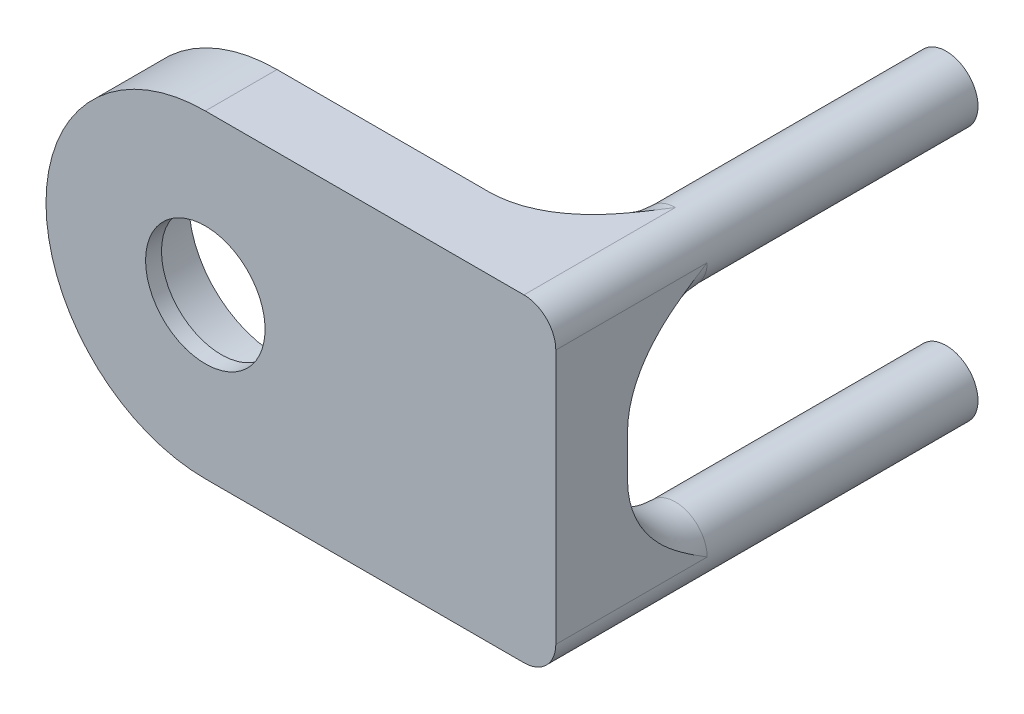
ISO-10303-21;
HEADER;
FILE_DESCRIPTION(('STEP AP214'),'2;1');
FILE_NAME('part.step','',(''),(''),'','','');
FILE_SCHEMA(('AUTOMOTIVE_DESIGN { 1 0 10303 214 1 1 1 1 }'));
ENDSEC;
DATA;
#1=APPLICATION_CONTEXT('core data for automotive mechanical design processes');
#2=APPLICATION_PROTOCOL_DEFINITION('international standard','automotive_design',2000,#1);
#3=PRODUCT_CONTEXT('',#1,'mechanical');
#4=PRODUCT('Part','Part','',(#3));
#5=PRODUCT_RELATED_PRODUCT_CATEGORY('part','',(#4));
#6=PRODUCT_DEFINITION_FORMATION('','',#4);
#7=PRODUCT_DEFINITION_CONTEXT('part definition',#1,'design');
#8=PRODUCT_DEFINITION('design','',#6,#7);
#9=PRODUCT_DEFINITION_SHAPE('','',#8);
#10=(LENGTH_UNIT() NAMED_UNIT(*) SI_UNIT(.MILLI.,.METRE.));
#11=(NAMED_UNIT(*) PLANE_ANGLE_UNIT() SI_UNIT($,.RADIAN.));
#12=(NAMED_UNIT(*) SI_UNIT($,.STERADIAN.) SOLID_ANGLE_UNIT());
#13=UNCERTAINTY_MEASURE_WITH_UNIT(LENGTH_MEASURE(1.E-05),#10,'distance_accuracy_value','');
#14=(GEOMETRIC_REPRESENTATION_CONTEXT(3) GLOBAL_UNCERTAINTY_ASSIGNED_CONTEXT((#13)) GLOBAL_UNIT_ASSIGNED_CONTEXT((#10,
#11,#12)) REPRESENTATION_CONTEXT('',''));
#15=CARTESIAN_POINT('',(0.,0.,0.));
#16=DIRECTION('',(0.,0.,1.));
#17=DIRECTION('',(1.,0.,0.));
#18=AXIS2_PLACEMENT_3D('',#15,#16,#17);
#19=CARTESIAN_POINT('',(40.,16.,9.));
#20=DIRECTION('',(0.,0.,-1.));
#21=DIRECTION('',(-1.,0.,0.));
#22=AXIS2_PLACEMENT_3D('',#19,#20,#21);
#23=CYLINDRICAL_SURFACE('',#22,4.);
#24=DIRECTION('',(0.,0.,-1.));
#25=VECTOR('',#24,1.);
#26=CARTESIAN_POINT('',(44.,16.,9.));
#27=LINE('',#26,#25);
#28=CARTESIAN_POINT('',(44.,16.,9.));
#29=VERTEX_POINT('',#28);
#30=CARTESIAN_POINT('',(44.,16.,-10.));
#31=VERTEX_POINT('',#30);
#32=EDGE_CURVE('E67',#29,#31,#27,.T.);
#33=ORIENTED_EDGE('',*,*,#32,.T.);
#34=CARTESIAN_POINT('',(40.,16.,-10.));
#35=DIRECTION('',(0.,0.,1.));
#36=DIRECTION('',(1.,0.,0.));
#37=AXIS2_PLACEMENT_3D('',#34,#35,#36);
#38=CIRCLE('',#37,4.);
#39=CARTESIAN_POINT('',(40.,20.,-10.));
#40=VERTEX_POINT('',#39);
#41=EDGE_CURVE('E128',#31,#40,#38,.F.);
#42=ORIENTED_EDGE('',*,*,#41,.T.);
#43=DIRECTION('',(0.,0.,-1.));
#44=VECTOR('',#43,1.);
#45=CARTESIAN_POINT('',(40.,20.,9.));
#46=LINE('',#45,#44);
#47=CARTESIAN_POINT('',(40.,20.,9.));
#48=VERTEX_POINT('',#47);
#49=EDGE_CURVE('E74',#48,#40,#46,.T.);
#50=ORIENTED_EDGE('',*,*,#49,.F.);
#51=CARTESIAN_POINT('',(40.,16.,9.));
#52=DIRECTION('',(0.,0.,1.));
#53=DIRECTION('',(1.,0.,0.));
#54=AXIS2_PLACEMENT_3D('',#51,#52,#53);
#55=CIRCLE('',#54,4.);
#56=EDGE_CURVE('E117',#29,#48,#55,.T.);
#57=ORIENTED_EDGE('',*,*,#56,.F.);
#58=EDGE_LOOP('',(#33,#42,#50,#57));
#59=FACE_BOUND('',#58,.T.);
#60=CARTESIAN_POINT('',(40.,16.,-44.));
#61=DIRECTION('',(0.,0.,1.));
#62=DIRECTION('',(1.,0.,0.));
#63=AXIS2_PLACEMENT_3D('',#60,#61,#62);
#64=CIRCLE('',#63,4.);
#65=CARTESIAN_POINT('',(44.,16.,-44.));
#66=VERTEX_POINT('',#65);
#67=EDGE_CURVE('E159',#66,#66,#64,.T.);
#68=ORIENTED_EDGE('',*,*,#67,.T.);
#69=EDGE_LOOP('',(#68));
#70=FACE_BOUND('',#69,.T.);
#71=ADVANCED_FACE('F45',(#59,#70),#23,.T.);
#72=CARTESIAN_POINT('',(0.,20.,9.));
#73=DIRECTION('',(0.,1.,0.));
#74=DIRECTION('',(0.,0.,1.));
#75=AXIS2_PLACEMENT_3D('',#72,#73,#74);
#76=PLANE('',#75);
#77=DIRECTION('',(1.,0.,0.));
#78=VECTOR('',#77,1.);
#79=CARTESIAN_POINT('',(0.,20.,0.));
#80=LINE('',#79,#78);
#81=CARTESIAN_POINT('',(0.,20.,0.));
#82=VERTEX_POINT('',#81);
#83=CARTESIAN_POINT('',(26.5835921350013,20.,0.));
#84=VERTEX_POINT('',#83);
#85=EDGE_CURVE('E154',#82,#84,#80,.T.);
#86=ORIENTED_EDGE('',*,*,#85,.F.);
#87=DIRECTION('',(0.,0.,-1.));
#88=VECTOR('',#87,1.);
#89=CARTESIAN_POINT('',(0.,20.,9.));
#90=LINE('',#89,#88);
#91=CARTESIAN_POINT('',(0.,20.,9.));
#92=VERTEX_POINT('',#91);
#93=EDGE_CURVE('E132',#92,#82,#90,.T.);
#94=ORIENTED_EDGE('',*,*,#93,.F.);
#95=DIRECTION('',(1.,0.,0.));
#96=VECTOR('',#95,1.);
#97=CARTESIAN_POINT('',(0.,20.,9.));
#98=LINE('',#97,#96);
#99=EDGE_CURVE('E119',#92,#48,#98,.T.);
#100=ORIENTED_EDGE('',*,*,#99,.T.);
#101=ORIENTED_EDGE('',*,*,#49,.T.);
#102=CARTESIAN_POINT('',(26.5835921350013,20.,0.));
#103=CARTESIAN_POINT('',(26.8809516686024,20.,3.64121735755326E-05));
#104=CARTESIAN_POINT('',(27.178266555593,20.,-0.0121779553737047));
#105=CARTESIAN_POINT('',(27.7708216060872,20.,-0.060433212882274));
#106=CARTESIAN_POINT('',(28.0660626850312,20.,-0.0964628220020149));
#107=CARTESIAN_POINT('',(28.6515818603697,20.,-0.19148198977355));
#108=CARTESIAN_POINT('',(28.9418752119144,20.,-0.250377989881912));
#109=CARTESIAN_POINT('',(29.5171165282485,20.,-0.390249114793386));
#110=CARTESIAN_POINT('',(29.8020637628394,20.,-0.471227232550418));
#111=CARTESIAN_POINT('',(30.3851129578302,20.,-0.660718963975165));
#112=CARTESIAN_POINT('',(30.6827121028883,20.,-0.770779611363978));
#113=CARTESIAN_POINT('',(31.2684928113692,20.,-1.01355022579294));
#114=CARTESIAN_POINT('',(31.556674325713,20.,-1.14626031084619));
#115=CARTESIAN_POINT('',(32.1225820892367,20.,-1.43280804743053));
#116=CARTESIAN_POINT('',(32.4003004413116,20.,-1.58666126530669));
#117=CARTESIAN_POINT('',(32.9441540822394,20.,-1.9136737536213));
#118=CARTESIAN_POINT('',(33.2102867892699,20.,-2.08683729699013));
#119=CARTESIAN_POINT('',(33.8583241051967,20.,-2.54019076968348));
#120=CARTESIAN_POINT('',(34.2327564965131,20.,-2.83111631670245));
#121=CARTESIAN_POINT('',(34.9537962763999,20.,-3.44562094299564));
#122=CARTESIAN_POINT('',(35.3003905747746,20.,-3.7692152244108));
#123=CARTESIAN_POINT('',(35.9673166372839,20.,-4.44323679085077));
#124=CARTESIAN_POINT('',(36.2876066982988,20.,-4.79370504405771));
#125=CARTESIAN_POINT('',(36.9040754272492,20.,-5.51496260403357));
#126=CARTESIAN_POINT('',(37.2002578774335,20.,-5.88574870779741));
#127=CARTESIAN_POINT('',(37.7120142376258,20.,-6.56174339826604));
#128=CARTESIAN_POINT('',(37.9313427564394,20.,-6.86414345587507));
#129=CARTESIAN_POINT('',(38.3601306303565,20.,-7.47526701037454));
#130=CARTESIAN_POINT('',(38.5696019153139,20.,-7.78398217897754));
#131=CARTESIAN_POINT('',(38.9824957240863,20.,-8.40663842639061));
#132=CARTESIAN_POINT('',(39.1858997051056,20.,-8.72059169998406));
#133=CARTESIAN_POINT('',(39.589316450551,20.,-9.35072263603975));
#134=CARTESIAN_POINT('',(39.7893286850409,20.,-9.6669006353767));
#135=CARTESIAN_POINT('',(39.9928730339802,20.,-9.98873127683946));
#136=CARTESIAN_POINT('',(39.996436517218,20.,-9.9943656385432));
#137=CARTESIAN_POINT('',(40.,20.,-10.));
#138=B_SPLINE_CURVE_WITH_KNOTS('',3,(#102,#103,#104,#105,#106,#107,#108,#109,#110,#111,#112,
#113,#114,#115,#116,#117,#118,#119,#120,#121,#122,#123,#124,#125,#126,#127,#128,#129,#130,#131,
#132,#133,#134,#135,#136,#137),.UNSPECIFIED.,.F.,.F.,(4,2,2,2,2,2,2,2,2,2,2,2,2,2,2,2,2,4),(0.,
0.891761662244704,1.7831012158249,2.67083161963278,3.55868240401096,4.50958300773826,
5.46048856620904,6.41209800458597,7.36391843162082,8.78410515609927,10.2049558265647,
11.6280173128513,13.0508551025963,14.1713330349874,15.2904180502708,16.4126309257427,
17.5350175527878,17.5550175527878),.UNSPECIFIED.);
#139=EDGE_CURVE('E11',#40,#84,#138,.F.);
#140=ORIENTED_EDGE('',*,*,#139,.T.);
#141=EDGE_LOOP('',(#86,#94,#100,#101,#140));
#142=FACE_BOUND('',#141,.T.);
#143=ADVANCED_FACE('F135',(#142),#76,.T.);
#144=CARTESIAN_POINT('',(0.,0.,9.));
#145=DIRECTION('',(0.,0.,-1.));
#146=DIRECTION('',(-1.,0.,0.));
#147=AXIS2_PLACEMENT_3D('',#144,#145,#146);
#148=CYLINDRICAL_SURFACE('',#147,20.);
#149=CARTESIAN_POINT('',(0.,0.,0.));
#150=DIRECTION('',(0.,0.,1.));
#151=DIRECTION('',(1.,0.,0.));
#152=AXIS2_PLACEMENT_3D('',#149,#150,#151);
#153=CIRCLE('',#152,20.);
#154=CARTESIAN_POINT('',(0.,-20.,0.));
#155=VERTEX_POINT('',#154);
#156=EDGE_CURVE('E158',#82,#155,#153,.T.);
#157=ORIENTED_EDGE('',*,*,#156,.T.);
#158=DIRECTION('',(0.,0.,-1.));
#159=VECTOR('',#158,1.);
#160=CARTESIAN_POINT('',(0.,-20.,9.));
#161=LINE('',#160,#159);
#162=CARTESIAN_POINT('',(0.,-20.,9.));
#163=VERTEX_POINT('',#162);
#164=EDGE_CURVE('E177',#163,#155,#161,.T.);
#165=ORIENTED_EDGE('',*,*,#164,.F.);
#166=CARTESIAN_POINT('',(0.,0.,9.));
#167=DIRECTION('',(0.,0.,1.));
#168=DIRECTION('',(1.,0.,0.));
#169=AXIS2_PLACEMENT_3D('',#166,#167,#168);
#170=CIRCLE('',#169,20.);
#171=EDGE_CURVE('E138',#92,#163,#170,.T.);
#172=ORIENTED_EDGE('',*,*,#171,.F.);
#173=ORIENTED_EDGE('',*,*,#93,.T.);
#174=EDGE_LOOP('',(#157,#165,#172,#173));
#175=FACE_BOUND('',#174,.T.);
#176=ADVANCED_FACE('F225',(#175),#148,.T.);
#177=CARTESIAN_POINT('',(0.,-20.,9.));
#178=DIRECTION('',(0.,-1.,0.));
#179=DIRECTION('',(0.,0.,-1.));
#180=AXIS2_PLACEMENT_3D('',#177,#178,#179);
#181=PLANE('',#180);
#182=DIRECTION('',(-1.,0.,0.));
#183=VECTOR('',#182,1.);
#184=CARTESIAN_POINT('',(0.,-20.,0.));
#185=LINE('',#184,#183);
#186=CARTESIAN_POINT('',(26.5835921350013,-20.,0.));
#187=VERTEX_POINT('',#186);
#188=EDGE_CURVE('E163',#187,#155,#185,.T.);
#189=ORIENTED_EDGE('',*,*,#188,.F.);
#190=CARTESIAN_POINT('',(26.5835921350013,-20.,0.));
#191=CARTESIAN_POINT('',(26.8809516686024,-20.,3.64121735755326E-05));
#192=CARTESIAN_POINT('',(27.178266555593,-20.,-0.0121779553737047));
#193=CARTESIAN_POINT('',(27.7708216060872,-20.,-0.060433212882274));
#194=CARTESIAN_POINT('',(28.0660626850312,-20.,-0.0964628220020149));
#195=CARTESIAN_POINT('',(28.6515818603697,-20.,-0.19148198977355));
#196=CARTESIAN_POINT('',(28.9418752119144,-20.,-0.250377989881912));
#197=CARTESIAN_POINT('',(29.5171165282485,-20.,-0.390249114793386));
#198=CARTESIAN_POINT('',(29.8020637628394,-20.,-0.471227232550418));
#199=CARTESIAN_POINT('',(30.3851129578302,-20.,-0.660718963975165));
#200=CARTESIAN_POINT('',(30.6827121028883,-20.,-0.770779611363978));
#201=CARTESIAN_POINT('',(31.2684928113692,-20.,-1.01355022579294));
#202=CARTESIAN_POINT('',(31.556674325713,-20.,-1.14626031084619));
#203=CARTESIAN_POINT('',(32.1225820892367,-20.,-1.43280804743053));
#204=CARTESIAN_POINT('',(32.4003004413116,-20.,-1.58666126530669));
#205=CARTESIAN_POINT('',(32.9441540822394,-20.,-1.9136737536213));
#206=CARTESIAN_POINT('',(33.2102867892699,-20.,-2.08683729699013));
#207=CARTESIAN_POINT('',(33.8583241051967,-20.,-2.54019076968348));
#208=CARTESIAN_POINT('',(34.2327564965131,-20.,-2.83111631670245));
#209=CARTESIAN_POINT('',(34.9537962763999,-20.,-3.44562094299564));
#210=CARTESIAN_POINT('',(35.3003905747746,-20.,-3.7692152244108));
#211=CARTESIAN_POINT('',(35.9673166372839,-20.,-4.44323679085077));
#212=CARTESIAN_POINT('',(36.2876066982988,-20.,-4.79370504405771));
#213=CARTESIAN_POINT('',(36.9040754272492,-20.,-5.51496260403357));
#214=CARTESIAN_POINT('',(37.2002578774335,-20.,-5.88574870779741));
#215=CARTESIAN_POINT('',(37.7120142376258,-20.,-6.56174339826604));
#216=CARTESIAN_POINT('',(37.9313427564394,-20.,-6.86414345587507));
#217=CARTESIAN_POINT('',(38.3601306303565,-20.,-7.47526701037454));
#218=CARTESIAN_POINT('',(38.5696019153139,-20.,-7.78398217897754));
#219=CARTESIAN_POINT('',(38.9824957240863,-20.,-8.40663842639061));
#220=CARTESIAN_POINT('',(39.1858997051056,-20.,-8.72059169998406));
#221=CARTESIAN_POINT('',(39.589316450551,-20.,-9.35072263603975));
#222=CARTESIAN_POINT('',(39.7893286850409,-20.,-9.6669006353767));
#223=CARTESIAN_POINT('',(39.9928730339802,-20.,-9.98873127683946));
#224=CARTESIAN_POINT('',(39.996436517218,-20.,-9.9943656385432));
#225=CARTESIAN_POINT('',(40.,-20.,-10.));
#226=B_SPLINE_CURVE_WITH_KNOTS('',3,(#190,#191,#192,#193,#194,#195,#196,#197,#198,#199,#200,
#201,#202,#203,#204,#205,#206,#207,#208,#209,#210,#211,#212,#213,#214,#215,#216,#217,#218,#219,
#220,#221,#222,#223,#224,#225),.UNSPECIFIED.,.F.,.F.,(4,2,2,2,2,2,2,2,2,2,2,2,2,2,2,2,2,4),(0.,
0.891761662244704,1.7831012158249,2.67083161963278,3.55868240401096,4.50958300773826,
5.46048856620904,6.41209800458597,7.36391843162082,8.78410515609927,10.2049558265647,
11.6280173128513,13.0508551025963,14.1713330349874,15.2904180502708,16.4126309257427,
17.5350175527878,17.5550175527878),.UNSPECIFIED.);
#227=CARTESIAN_POINT('',(40.,-20.,-10.));
#228=VERTEX_POINT('',#227);
#229=EDGE_CURVE('E204',#187,#228,#226,.T.);
#230=ORIENTED_EDGE('',*,*,#229,.T.);
#231=DIRECTION('',(0.,0.,-1.));
#232=VECTOR('',#231,1.);
#233=CARTESIAN_POINT('',(40.,-20.,9.));
#234=LINE('',#233,#232);
#235=CARTESIAN_POINT('',(40.,-20.,9.));
#236=VERTEX_POINT('',#235);
#237=EDGE_CURVE('E174',#236,#228,#234,.T.);
#238=ORIENTED_EDGE('',*,*,#237,.F.);
#239=DIRECTION('',(-1.,0.,0.));
#240=VECTOR('',#239,1.);
#241=CARTESIAN_POINT('',(0.,-20.,9.));
#242=LINE('',#241,#240);
#243=EDGE_CURVE('E141',#236,#163,#242,.T.);
#244=ORIENTED_EDGE('',*,*,#243,.T.);
#245=ORIENTED_EDGE('',*,*,#164,.T.);
#246=EDGE_LOOP('',(#189,#230,#238,#244,#245));
#247=FACE_BOUND('',#246,.T.);
#248=ADVANCED_FACE('F227',(#247),#181,.T.);
#249=CARTESIAN_POINT('',(40.,-16.,9.));
#250=DIRECTION('',(0.,0.,-1.));
#251=DIRECTION('',(-1.,0.,0.));
#252=AXIS2_PLACEMENT_3D('',#249,#250,#251);
#253=CYLINDRICAL_SURFACE('',#252,4.);
#254=CARTESIAN_POINT('',(40.,-16.,-10.));
#255=DIRECTION('',(0.,0.,1.));
#256=DIRECTION('',(1.,0.,0.));
#257=AXIS2_PLACEMENT_3D('',#254,#255,#256);
#258=CIRCLE('',#257,4.);
#259=CARTESIAN_POINT('',(44.,-16.,-10.));
#260=VERTEX_POINT('',#259);
#261=EDGE_CURVE('E183',#228,#260,#258,.F.);
#262=ORIENTED_EDGE('',*,*,#261,.T.);
#263=DIRECTION('',(0.,0.,-1.));
#264=VECTOR('',#263,1.);
#265=CARTESIAN_POINT('',(44.,-16.,9.));
#266=LINE('',#265,#264);
#267=CARTESIAN_POINT('',(44.,-16.,9.));
#268=VERTEX_POINT('',#267);
#269=EDGE_CURVE('E171',#268,#260,#266,.T.);
#270=ORIENTED_EDGE('',*,*,#269,.F.);
#271=CARTESIAN_POINT('',(40.,-16.,9.));
#272=DIRECTION('',(0.,0.,1.));
#273=DIRECTION('',(1.,0.,0.));
#274=AXIS2_PLACEMENT_3D('',#271,#272,#273);
#275=CIRCLE('',#274,4.);
#276=EDGE_CURVE('E148',#268,#236,#275,.F.);
#277=ORIENTED_EDGE('',*,*,#276,.T.);
#278=ORIENTED_EDGE('',*,*,#237,.T.);
#279=EDGE_LOOP('',(#262,#270,#277,#278));
#280=FACE_BOUND('',#279,.T.);
#281=CARTESIAN_POINT('',(40.,-16.,-44.));
#282=DIRECTION('',(0.,0.,1.));
#283=DIRECTION('',(1.,0.,0.));
#284=AXIS2_PLACEMENT_3D('',#281,#282,#283);
#285=CIRCLE('',#284,4.);
#286=CARTESIAN_POINT('',(44.,-16.,-44.));
#287=VERTEX_POINT('',#286);
#288=EDGE_CURVE('E243',#287,#287,#285,.F.);
#289=ORIENTED_EDGE('',*,*,#288,.F.);
#290=EDGE_LOOP('',(#289));
#291=FACE_BOUND('',#290,.T.);
#292=ADVANCED_FACE('F231',(#280,#291),#253,.T.);
#293=CARTESIAN_POINT('',(44.,0.,9.));
#294=DIRECTION('',(1.,0.,0.));
#295=DIRECTION('',(0.,0.,-1.));
#296=AXIS2_PLACEMENT_3D('',#293,#294,#295);
#297=PLANE('',#296);
#298=DIRECTION('',(0.,-1.,0.));
#299=VECTOR('',#298,1.);
#300=CARTESIAN_POINT('',(44.,0.,0.));
#301=LINE('',#300,#299);
#302=CARTESIAN_POINT('',(44.,2.58359213500127,0.));
#303=VERTEX_POINT('',#302);
#304=CARTESIAN_POINT('',(44.,-2.58359213500127,0.));
#305=VERTEX_POINT('',#304);
#306=EDGE_CURVE('E124',#303,#305,#301,.T.);
#307=ORIENTED_EDGE('',*,*,#306,.F.);
#308=CARTESIAN_POINT('',(44.,2.58359213500127,0.));
#309=CARTESIAN_POINT('',(44.,2.8809516686023,3.64121735780869E-05));
#310=CARTESIAN_POINT('',(44.,3.17826655559285,-0.0121779553736944));
#311=CARTESIAN_POINT('',(44.,3.77082160608686,-0.0604332128822348));
#312=CARTESIAN_POINT('',(44.,4.06606268503074,-0.0964628220019547));
#313=CARTESIAN_POINT('',(44.,4.65158186036921,-0.191481989773461));
#314=CARTESIAN_POINT('',(44.,4.94187521191401,-0.25037798988183));
#315=CARTESIAN_POINT('',(44.,5.51711652824838,-0.390249114793334));
#316=CARTESIAN_POINT('',(44.,5.80206376283934,-0.47122723255039));
#317=CARTESIAN_POINT('',(44.,6.38511295783031,-0.660718963975188));
#318=CARTESIAN_POINT('',(44.,6.68271210288844,-0.770779611364027));
#319=CARTESIAN_POINT('',(44.,7.26849281136952,-1.01355022579306));
#320=CARTESIAN_POINT('',(44.,7.55667432571332,-1.14626031084635));
#321=CARTESIAN_POINT('',(44.,8.12258208923708,-1.43280804743071));
#322=CARTESIAN_POINT('',(44.,8.40030044131182,-1.58666126530683));
#323=CARTESIAN_POINT('',(44.,8.94415408223951,-1.91367375362138));
#324=CARTESIAN_POINT('',(44.,9.21028678927001,-2.08683729699018));
#325=CARTESIAN_POINT('',(44.,9.85832410519658,-2.54019076968339));
#326=CARTESIAN_POINT('',(44.,10.2327564965128,-2.83111631670225));
#327=CARTESIAN_POINT('',(44.,10.9537962763995,-3.44562094299521));
#328=CARTESIAN_POINT('',(44.,11.300390574774,-3.76921522441025));
#329=CARTESIAN_POINT('',(44.,11.9673166372834,-4.44323679085025));
#330=CARTESIAN_POINT('',(44.,12.2876066982983,-4.79370504405736));
#331=CARTESIAN_POINT('',(44.,12.9040754272491,-5.51496260403335));
#332=CARTESIAN_POINT('',(44.,13.2002578774338,-5.88574870779714));
#333=CARTESIAN_POINT('',(44.,13.7120142376257,-6.56174339826635));
#334=CARTESIAN_POINT('',(44.,13.9313427564387,-6.86414345587585));
#335=CARTESIAN_POINT('',(44.,14.3601306303576,-7.47526701037426));
#336=CARTESIAN_POINT('',(44.,14.5696019153173,-7.78398217897572));
#337=CARTESIAN_POINT('',(44.,14.9824957240832,-8.4066384263928));
#338=CARTESIAN_POINT('',(44.,15.1858997050937,-8.7205916999918));
#339=CARTESIAN_POINT('',(44.,15.5893164505631,-9.3507226360322));
#340=CARTESIAN_POINT('',(44.0000000000001,15.7893286850859,-9.6669006353483));
#341=CARTESIAN_POINT('',(44.,15.9928730339818,-9.98873127683846));
#342=CARTESIAN_POINT('',(44.,15.9964365172189,-9.99436563854269));
#343=CARTESIAN_POINT('',(44.,16.,-10.));
#344=B_SPLINE_CURVE_WITH_KNOTS('',3,(#308,#309,#310,#311,#312,#313,#314,#315,#316,#317,#318,
#319,#320,#321,#322,#323,#324,#325,#326,#327,#328,#329,#330,#331,#332,#333,#334,#335,#336,#337,
#338,#339,#340,#341,#342,#343),.UNSPECIFIED.,.F.,.F.,(4,2,2,2,2,2,2,2,2,2,2,2,2,2,2,2,2,4),(0.,
0.891761662244419,1.78310121582433,2.6708316196325,3.55868240401096,4.50958300773847,
5.46048856620948,6.41209800458619,7.36391843162083,8.78410515609878,10.2049558265637,
11.628017312851,13.0508551025963,14.1713330349878,15.290418050271,16.4126309257429,
17.5350175527878,17.5550175527878),.UNSPECIFIED.);
#345=EDGE_CURVE('E60',#303,#31,#344,.T.);
#346=ORIENTED_EDGE('',*,*,#345,.T.);
#347=ORIENTED_EDGE('',*,*,#32,.F.);
#348=DIRECTION('',(0.,-1.,0.));
#349=VECTOR('',#348,1.);
#350=CARTESIAN_POINT('',(44.,0.,9.));
#351=LINE('',#350,#349);
#352=EDGE_CURVE('E122',#29,#268,#351,.T.);
#353=ORIENTED_EDGE('',*,*,#352,.T.);
#354=ORIENTED_EDGE('',*,*,#269,.T.);
#355=CARTESIAN_POINT('',(44.,-2.58359213500127,0.));
#356=CARTESIAN_POINT('',(44.,-2.8809516686023,3.64121735780869E-05));
#357=CARTESIAN_POINT('',(44.,-3.17826655559285,-0.0121779553736944));
#358=CARTESIAN_POINT('',(44.,-3.77082160608686,-0.0604332128822348));
#359=CARTESIAN_POINT('',(44.,-4.06606268503074,-0.0964628220019547));
#360=CARTESIAN_POINT('',(44.,-4.65158186036921,-0.191481989773461));
#361=CARTESIAN_POINT('',(44.,-4.94187521191401,-0.25037798988183));
#362=CARTESIAN_POINT('',(44.,-5.51711652824838,-0.390249114793334));
#363=CARTESIAN_POINT('',(44.,-5.80206376283934,-0.47122723255039));
#364=CARTESIAN_POINT('',(44.,-6.38511295783031,-0.660718963975188));
#365=CARTESIAN_POINT('',(44.,-6.68271210288844,-0.770779611364027));
#366=CARTESIAN_POINT('',(44.,-7.26849281136952,-1.01355022579306));
#367=CARTESIAN_POINT('',(44.,-7.55667432571332,-1.14626031084635));
#368=CARTESIAN_POINT('',(44.,-8.12258208923708,-1.43280804743071));
#369=CARTESIAN_POINT('',(44.,-8.40030044131182,-1.58666126530683));
#370=CARTESIAN_POINT('',(44.,-8.94415408223951,-1.91367375362138));
#371=CARTESIAN_POINT('',(44.,-9.21028678927001,-2.08683729699018));
#372=CARTESIAN_POINT('',(44.,-9.85832410519658,-2.54019076968339));
#373=CARTESIAN_POINT('',(44.,-10.2327564965128,-2.83111631670225));
#374=CARTESIAN_POINT('',(44.,-10.9537962763995,-3.44562094299521));
#375=CARTESIAN_POINT('',(44.,-11.300390574774,-3.76921522441025));
#376=CARTESIAN_POINT('',(44.,-11.9673166372834,-4.44323679085025));
#377=CARTESIAN_POINT('',(44.,-12.2876066982983,-4.79370504405736));
#378=CARTESIAN_POINT('',(44.,-12.9040754272491,-5.51496260403335));
#379=CARTESIAN_POINT('',(44.,-13.2002578774338,-5.88574870779714));
#380=CARTESIAN_POINT('',(44.,-13.7120142376257,-6.56174339826635));
#381=CARTESIAN_POINT('',(44.,-13.9313427564387,-6.86414345587585));
#382=CARTESIAN_POINT('',(44.,-14.3601306303576,-7.47526701037426));
#383=CARTESIAN_POINT('',(44.,-14.5696019153173,-7.78398217897572));
#384=CARTESIAN_POINT('',(44.,-14.9824957240832,-8.4066384263928));
#385=CARTESIAN_POINT('',(44.,-15.1858997050937,-8.7205916999918));
#386=CARTESIAN_POINT('',(44.,-15.5893164505631,-9.3507226360322));
#387=CARTESIAN_POINT('',(44.0000000000001,-15.7893286850859,-9.6669006353483));
#388=CARTESIAN_POINT('',(44.,-15.9928730339818,-9.98873127683846));
#389=CARTESIAN_POINT('',(44.,-15.9964365172189,-9.99436563854269));
#390=CARTESIAN_POINT('',(44.,-16.,-10.));
#391=B_SPLINE_CURVE_WITH_KNOTS('',3,(#355,#356,#357,#358,#359,#360,#361,#362,#363,#364,#365,
#366,#367,#368,#369,#370,#371,#372,#373,#374,#375,#376,#377,#378,#379,#380,#381,#382,#383,#384,
#385,#386,#387,#388,#389,#390),.UNSPECIFIED.,.F.,.F.,(4,2,2,2,2,2,2,2,2,2,2,2,2,2,2,2,2,4),(0.,
0.891761662244419,1.78310121582433,2.6708316196325,3.55868240401096,4.50958300773847,
5.46048856620948,6.41209800458619,7.36391843162083,8.78410515609878,10.2049558265637,
11.628017312851,13.0508551025963,14.1713330349878,15.290418050271,16.4126309257429,
17.5350175527878,17.5550175527878),.UNSPECIFIED.);
#392=EDGE_CURVE('E196',#260,#305,#391,.F.);
#393=ORIENTED_EDGE('',*,*,#392,.T.);
#394=EDGE_LOOP('',(#307,#346,#347,#353,#354,#393));
#395=FACE_BOUND('',#394,.T.);
#396=ADVANCED_FACE('F210',(#395),#297,.T.);
#397=CARTESIAN_POINT('',(0.,0.,9.));
#398=DIRECTION('',(0.,0.,1.));
#399=DIRECTION('',(1.,0.,0.));
#400=AXIS2_PLACEMENT_3D('',#397,#398,#399);
#401=PLANE('',#400);
#402=CARTESIAN_POINT('',(0.,0.,9.));
#403=DIRECTION('',(0.,0.,-1.));
#404=DIRECTION('',(-1.,0.,0.));
#405=AXIS2_PLACEMENT_3D('',#402,#403,#404);
#406=CIRCLE('',#405,7.5);
#407=CARTESIAN_POINT('',(-7.5,0.,9.));
#408=VERTEX_POINT('',#407);
#409=EDGE_CURVE('E312',#408,#408,#406,.T.);
#410=ORIENTED_EDGE('',*,*,#409,.T.);
#411=EDGE_LOOP('',(#410));
#412=FACE_BOUND('',#411,.T.);
#413=ORIENTED_EDGE('',*,*,#56,.T.);
#414=ORIENTED_EDGE('',*,*,#99,.F.);
#415=ORIENTED_EDGE('',*,*,#171,.T.);
#416=ORIENTED_EDGE('',*,*,#243,.F.);
#417=ORIENTED_EDGE('',*,*,#276,.F.);
#418=ORIENTED_EDGE('',*,*,#352,.F.);
#419=EDGE_LOOP('',(#413,#414,#415,#416,#417,#418));
#420=FACE_BOUND('',#419,.T.);
#421=ADVANCED_FACE('F118',(#412,#420),#401,.T.);
#422=CARTESIAN_POINT('',(0.,0.,0.));
#423=DIRECTION('',(0.,0.,1.));
#424=DIRECTION('',(1.,0.,0.));
#425=AXIS2_PLACEMENT_3D('',#422,#423,#424);
#426=PLANE('',#425);
#427=CARTESIAN_POINT('',(0.,0.,0.));
#428=DIRECTION('',(0.,0.,-1.));
#429=DIRECTION('',(-1.,0.,0.));
#430=AXIS2_PLACEMENT_3D('',#427,#428,#429);
#431=CIRCLE('',#430,11.075);
#432=CARTESIAN_POINT('',(-11.075,0.,0.));
#433=VERTEX_POINT('',#432);
#434=EDGE_CURVE('E258',#433,#433,#431,.T.);
#435=ORIENTED_EDGE('',*,*,#434,.F.);
#436=EDGE_LOOP('',(#435));
#437=FACE_BOUND('',#436,.T.);
#438=ORIENTED_EDGE('',*,*,#306,.T.);
#439=CARTESIAN_POINT('',(40.,-16.,0.));
#440=DIRECTION('',(0.,0.,1.));
#441=DIRECTION('',(1.,0.,0.));
#442=AXIS2_PLACEMENT_3D('',#439,#440,#441);
#443=CIRCLE('',#442,14.);
#444=EDGE_CURVE('E191',#305,#187,#443,.T.);
#445=ORIENTED_EDGE('',*,*,#444,.T.);
#446=ORIENTED_EDGE('',*,*,#188,.T.);
#447=ORIENTED_EDGE('',*,*,#156,.F.);
#448=ORIENTED_EDGE('',*,*,#85,.T.);
#449=CARTESIAN_POINT('',(40.,16.,0.));
#450=DIRECTION('',(0.,0.,1.));
#451=DIRECTION('',(1.,0.,0.));
#452=AXIS2_PLACEMENT_3D('',#449,#450,#451);
#453=CIRCLE('',#452,14.);
#454=EDGE_CURVE('E187',#84,#303,#453,.T.);
#455=ORIENTED_EDGE('',*,*,#454,.T.);
#456=EDGE_LOOP('',(#438,#445,#446,#447,#448,#455));
#457=FACE_BOUND('',#456,.T.);
#458=ADVANCED_FACE('F276',(#437,#457),#426,.F.);
#459=CARTESIAN_POINT('',(40.,16.,-44.));
#460=DIRECTION('',(0.,0.,1.));
#461=DIRECTION('',(1.,0.,0.));
#462=AXIS2_PLACEMENT_3D('',#459,#460,#461);
#463=CYLINDRICAL_SURFACE('',#462,1.45000000000001);
#464=CARTESIAN_POINT('',(40.,16.,-44.));
#465=DIRECTION('',(0.,0.,1.));
#466=DIRECTION('',(1.,0.,0.));
#467=AXIS2_PLACEMENT_3D('',#464,#465,#466);
#468=CIRCLE('',#467,1.45000000000001);
#469=CARTESIAN_POINT('',(41.45,16.,-44.));
#470=VERTEX_POINT('',#469);
#471=EDGE_CURVE('E252',#470,#470,#468,.T.);
#472=ORIENTED_EDGE('',*,*,#471,.F.);
#473=EDGE_LOOP('',(#472));
#474=FACE_BOUND('',#473,.T.);
#475=CARTESIAN_POINT('',(40.,16.,0.));
#476=DIRECTION('',(0.,0.,1.));
#477=DIRECTION('',(1.,0.,0.));
#478=AXIS2_PLACEMENT_3D('',#475,#476,#477);
#479=CIRCLE('',#478,1.45000000000001);
#480=CARTESIAN_POINT('',(41.45,16.,0.));
#481=VERTEX_POINT('',#480);
#482=EDGE_CURVE('E131',#481,#481,#479,.T.);
#483=ORIENTED_EDGE('',*,*,#482,.T.);
#484=EDGE_LOOP('',(#483));
#485=FACE_BOUND('',#484,.T.);
#486=ADVANCED_FACE('F270',(#474,#485),#463,.F.);
#487=CARTESIAN_POINT('',(0.,0.,-44.));
#488=DIRECTION('',(0.,0.,1.));
#489=DIRECTION('',(1.,0.,0.));
#490=AXIS2_PLACEMENT_3D('',#487,#488,#489);
#491=PLANE('',#490);
#492=ORIENTED_EDGE('',*,*,#471,.T.);
#493=EDGE_LOOP('',(#492));
#494=FACE_BOUND('',#493,.T.);
#495=ORIENTED_EDGE('',*,*,#67,.F.);
#496=EDGE_LOOP('',(#495));
#497=FACE_BOUND('',#496,.T.);
#498=ADVANCED_FACE('F275',(#494,#497),#491,.F.);
#499=ORIENTED_EDGE('',*,*,#482,.F.);
#500=EDGE_LOOP('',(#499));
#501=FACE_BOUND('',#500,.T.);
#502=ADVANCED_FACE('F272',(#501),#426,.F.);
#503=CARTESIAN_POINT('',(40.,-16.,-44.));
#504=DIRECTION('',(0.,0.,1.));
#505=DIRECTION('',(1.,0.,0.));
#506=AXIS2_PLACEMENT_3D('',#503,#504,#505);
#507=CYLINDRICAL_SURFACE('',#506,1.45000000000001);
#508=CARTESIAN_POINT('',(40.,-16.,-44.));
#509=DIRECTION('',(0.,0.,1.));
#510=DIRECTION('',(1.,0.,0.));
#511=AXIS2_PLACEMENT_3D('',#508,#509,#510);
#512=CIRCLE('',#511,1.45000000000001);
#513=CARTESIAN_POINT('',(41.45,-16.,-44.));
#514=VERTEX_POINT('',#513);
#515=EDGE_CURVE('E246',#514,#514,#512,.F.);
#516=ORIENTED_EDGE('',*,*,#515,.T.);
#517=EDGE_LOOP('',(#516));
#518=FACE_BOUND('',#517,.T.);
#519=CARTESIAN_POINT('',(40.,-16.,0.));
#520=DIRECTION('',(0.,0.,1.));
#521=DIRECTION('',(1.,0.,0.));
#522=AXIS2_PLACEMENT_3D('',#519,#520,#521);
#523=CIRCLE('',#522,1.45000000000001);
#524=CARTESIAN_POINT('',(41.45,-16.,0.));
#525=VERTEX_POINT('',#524);
#526=EDGE_CURVE('E247',#525,#525,#523,.F.);
#527=ORIENTED_EDGE('',*,*,#526,.F.);
#528=EDGE_LOOP('',(#527));
#529=FACE_BOUND('',#528,.T.);
#530=ADVANCED_FACE('F274',(#518,#529),#507,.F.);
#531=CARTESIAN_POINT('',(0.,0.,-44.));
#532=DIRECTION('',(0.,0.,1.));
#533=DIRECTION('',(1.,0.,0.));
#534=AXIS2_PLACEMENT_3D('',#531,#532,#533);
#535=PLANE('',#534);
#536=ORIENTED_EDGE('',*,*,#288,.T.);
#537=EDGE_LOOP('',(#536));
#538=FACE_BOUND('',#537,.T.);
#539=ORIENTED_EDGE('',*,*,#515,.F.);
#540=EDGE_LOOP('',(#539));
#541=FACE_BOUND('',#540,.T.);
#542=ADVANCED_FACE('F281',(#538,#541),#535,.F.);
#543=ORIENTED_EDGE('',*,*,#526,.T.);
#544=EDGE_LOOP('',(#543));
#545=FACE_BOUND('',#544,.T.);
#546=ADVANCED_FACE('F218',(#545),#426,.F.);
#547=CARTESIAN_POINT('',(40.,-16.,-10.));
#548=DIRECTION('',(0.,0.,1.));
#549=DIRECTION('',(1.,0.,0.));
#550=AXIS2_PLACEMENT_3D('',#547,#548,#549);
#551=TOROIDAL_SURFACE('',#550,14.,10.);
#552=ORIENTED_EDGE('',*,*,#229,.F.);
#553=ORIENTED_EDGE('',*,*,#444,.F.);
#554=ORIENTED_EDGE('',*,*,#392,.F.);
#555=ORIENTED_EDGE('',*,*,#261,.F.);
#556=EDGE_LOOP('',(#552,#553,#554,#555));
#557=FACE_BOUND('',#556,.T.);
#558=ADVANCED_FACE('F214',(#557),#551,.F.);
#559=CARTESIAN_POINT('',(40.,16.,-10.));
#560=DIRECTION('',(0.,0.,1.));
#561=DIRECTION('',(1.,0.,0.));
#562=AXIS2_PLACEMENT_3D('',#559,#560,#561);
#563=TOROIDAL_SURFACE('',#562,14.,10.);
#564=ORIENTED_EDGE('',*,*,#139,.F.);
#565=ORIENTED_EDGE('',*,*,#41,.F.);
#566=ORIENTED_EDGE('',*,*,#345,.F.);
#567=ORIENTED_EDGE('',*,*,#454,.F.);
#568=EDGE_LOOP('',(#564,#565,#566,#567));
#569=FACE_BOUND('',#568,.T.);
#570=ADVANCED_FACE('F47',(#569),#563,.F.);
#571=CARTESIAN_POINT('',(0.,0.,7.));
#572=DIRECTION('',(0.,0.,-1.));
#573=DIRECTION('',(-1.,0.,0.));
#574=AXIS2_PLACEMENT_3D('',#571,#572,#573);
#575=CYLINDRICAL_SURFACE('',#574,11.075);
#576=CARTESIAN_POINT('',(0.,0.,7.));
#577=DIRECTION('',(0.,0.,-1.));
#578=DIRECTION('',(-1.,0.,0.));
#579=AXIS2_PLACEMENT_3D('',#576,#577,#578);
#580=CIRCLE('',#579,11.075);
#581=CARTESIAN_POINT('',(-11.075,0.,7.));
#582=VERTEX_POINT('',#581);
#583=EDGE_CURVE('E255',#582,#582,#580,.T.);
#584=ORIENTED_EDGE('',*,*,#583,.F.);
#585=EDGE_LOOP('',(#584));
#586=FACE_BOUND('',#585,.T.);
#587=ORIENTED_EDGE('',*,*,#434,.T.);
#588=EDGE_LOOP('',(#587));
#589=FACE_BOUND('',#588,.T.);
#590=ADVANCED_FACE('F301',(#586,#589),#575,.F.);
#591=CARTESIAN_POINT('',(0.,0.,7.));
#592=DIRECTION('',(0.,0.,-1.));
#593=DIRECTION('',(-1.,0.,0.));
#594=AXIS2_PLACEMENT_3D('',#591,#592,#593);
#595=PLANE('',#594);
#596=CARTESIAN_POINT('',(0.,0.,7.));
#597=DIRECTION('',(0.,0.,-1.));
#598=DIRECTION('',(-1.,0.,0.));
#599=AXIS2_PLACEMENT_3D('',#596,#597,#598);
#600=CIRCLE('',#599,7.5);
#601=CARTESIAN_POINT('',(-7.5,0.,7.));
#602=VERTEX_POINT('',#601);
#603=EDGE_CURVE('E315',#602,#602,#600,.T.);
#604=ORIENTED_EDGE('',*,*,#603,.F.);
#605=EDGE_LOOP('',(#604));
#606=FACE_BOUND('',#605,.T.);
#607=ORIENTED_EDGE('',*,*,#583,.T.);
#608=EDGE_LOOP('',(#607));
#609=FACE_BOUND('',#608,.T.);
#610=ADVANCED_FACE('F326',(#606,#609),#595,.T.);
#611=CARTESIAN_POINT('',(0.,0.,9.));
#612=DIRECTION('',(0.,0.,-1.));
#613=DIRECTION('',(-1.,0.,0.));
#614=AXIS2_PLACEMENT_3D('',#611,#612,#613);
#615=CYLINDRICAL_SURFACE('',#614,7.5);
#616=ORIENTED_EDGE('',*,*,#409,.F.);
#617=EDGE_LOOP('',(#616));
#618=FACE_BOUND('',#617,.T.);
#619=ORIENTED_EDGE('',*,*,#603,.T.);
#620=EDGE_LOOP('',(#619));
#621=FACE_BOUND('',#620,.T.);
#622=ADVANCED_FACE('F366',(#618,#621),#615,.F.);
#623=CLOSED_SHELL('',(#71,#143,#176,#248,#292,#396,#421,#458,#486,#498,#502,#530,#542,#546,#558,
#570,#590,#610,#622));
#624=MANIFOLD_SOLID_BREP('B2',#623);
#625=ADVANCED_BREP_SHAPE_REPRESENTATION('',(#18,#624),#14);
#626=SHAPE_DEFINITION_REPRESENTATION(#9,#625);
ENDSEC;
END-ISO-10303-21;
